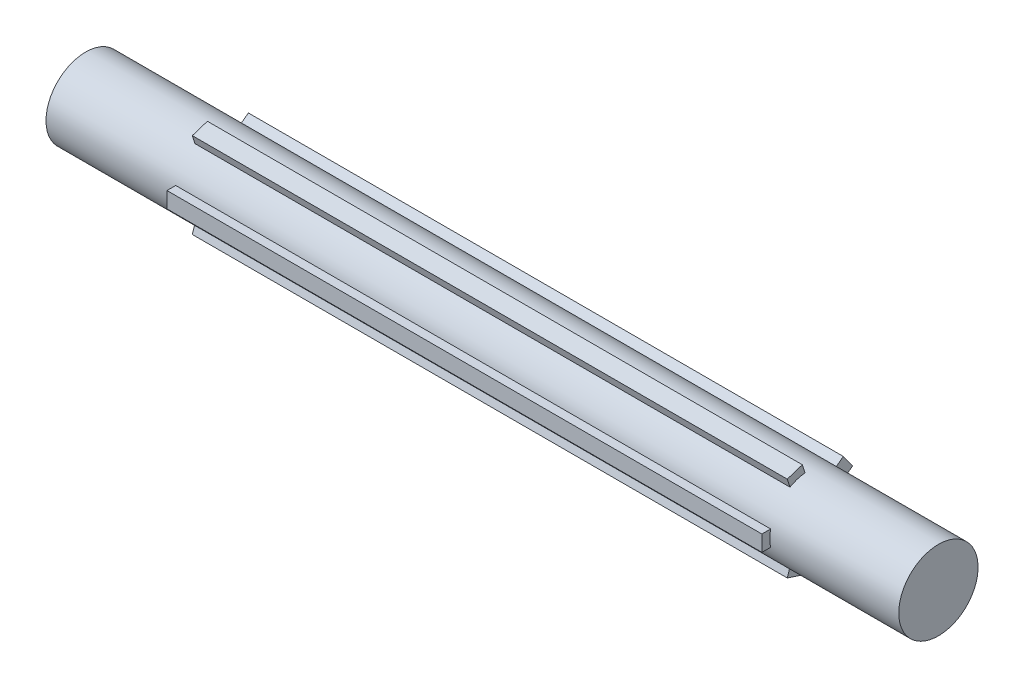
ISO-10303-21;
HEADER;
FILE_DESCRIPTION(('STEP AP214'),'2;1');
FILE_NAME('part.step','',(''),(''),'','','');
FILE_SCHEMA(('AUTOMOTIVE_DESIGN { 1 0 10303 214 1 1 1 1 }'));
ENDSEC;
DATA;
#1=APPLICATION_CONTEXT('core data for automotive mechanical design processes');
#2=APPLICATION_PROTOCOL_DEFINITION('international standard','automotive_design',2000,#1);
#3=PRODUCT_CONTEXT('',#1,'mechanical');
#4=PRODUCT('Part','Part','',(#3));
#5=PRODUCT_RELATED_PRODUCT_CATEGORY('part','',(#4));
#6=PRODUCT_DEFINITION_FORMATION('','',#4);
#7=PRODUCT_DEFINITION_CONTEXT('part definition',#1,'design');
#8=PRODUCT_DEFINITION('design','',#6,#7);
#9=PRODUCT_DEFINITION_SHAPE('','',#8);
#10=(LENGTH_UNIT() NAMED_UNIT(*) SI_UNIT(.MILLI.,.METRE.));
#11=(NAMED_UNIT(*) PLANE_ANGLE_UNIT() SI_UNIT($,.RADIAN.));
#12=(NAMED_UNIT(*) SI_UNIT($,.STERADIAN.) SOLID_ANGLE_UNIT());
#13=UNCERTAINTY_MEASURE_WITH_UNIT(LENGTH_MEASURE(1.E-05),#10,'distance_accuracy_value','');
#14=(GEOMETRIC_REPRESENTATION_CONTEXT(3) GLOBAL_UNCERTAINTY_ASSIGNED_CONTEXT((#13)) GLOBAL_UNIT_ASSIGNED_CONTEXT((#10,
#11,#12)) REPRESENTATION_CONTEXT('',''));
#15=CARTESIAN_POINT('',(0.,0.,0.));
#16=DIRECTION('',(0.,0.,1.));
#17=DIRECTION('',(1.,0.,0.));
#18=AXIS2_PLACEMENT_3D('',#15,#16,#17);
#19=CARTESIAN_POINT('',(0.,0.,0.));
#20=DIRECTION('',(-1.,0.,0.));
#21=DIRECTION('',(0.,0.,1.));
#22=AXIS2_PLACEMENT_3D('',#19,#20,#21);
#23=CYLINDRICAL_SURFACE('',#22,10.);
#24=CARTESIAN_POINT('',(75.,0.,0.));
#25=DIRECTION('',(-1.,0.,0.));
#26=DIRECTION('',(0.,0.,1.));
#27=AXIS2_PLACEMENT_3D('',#24,#25,#26);
#28=CIRCLE('',#27,10.);
#29=CARTESIAN_POINT('',(75.,-4.14106179704873,-9.10228582241975));
#30=VERTEX_POINT('',#29);
#31=CARTESIAN_POINT('',(75.,-7.3771297745485,-6.75114481324983));
#32=VERTEX_POINT('',#31);
#33=EDGE_CURVE('E332',#30,#32,#28,.T.);
#34=ORIENTED_EDGE('',*,*,#33,.F.);
#35=DIRECTION('',(-1.,0.,0.));
#36=VECTOR('',#35,1.);
#37=CARTESIAN_POINT('',(0.,-4.14106179704873,-9.10228582241975));
#38=LINE('',#37,#36);
#39=CARTESIAN_POINT('',(-75.,-4.14106179704873,-9.10228582241975));
#40=VERTEX_POINT('',#39);
#41=EDGE_CURVE('E328',#40,#30,#38,.F.);
#42=ORIENTED_EDGE('',*,*,#41,.F.);
#43=CARTESIAN_POINT('',(-75.,0.,0.));
#44=DIRECTION('',(-1.,0.,0.));
#45=DIRECTION('',(0.,0.,1.));
#46=AXIS2_PLACEMENT_3D('',#43,#44,#45);
#47=CIRCLE('',#46,10.);
#48=CARTESIAN_POINT('',(-75.,-7.3771297745485,-6.75114481324983));
#49=VERTEX_POINT('',#48);
#50=EDGE_CURVE('E325',#40,#49,#47,.T.);
#51=ORIENTED_EDGE('',*,*,#50,.T.);
#52=DIRECTION('',(-1.,0.,0.));
#53=VECTOR('',#52,1.);
#54=CARTESIAN_POINT('',(0.,-7.3771297745485,-6.75114481324983));
#55=LINE('',#54,#53);
#56=EDGE_CURVE('E330',#32,#49,#55,.T.);
#57=ORIENTED_EDGE('',*,*,#56,.F.);
#58=EDGE_LOOP('',(#34,#42,#51,#57));
#59=FACE_BOUND('',#58,.T.);
#60=CARTESIAN_POINT('',(75.,0.,0.));
#61=DIRECTION('',(-1.,0.,0.));
#62=DIRECTION('',(0.,0.,1.));
#63=AXIS2_PLACEMENT_3D('',#60,#61,#62);
#64=CIRCLE('',#63,10.);
#65=CARTESIAN_POINT('',(75.,8.70037873713845,4.92984886485877));
#66=VERTEX_POINT('',#65);
#67=CARTESIAN_POINT('',(75.,9.93644671463823,1.12562279967815));
#68=VERTEX_POINT('',#67);
#69=EDGE_CURVE('E315',#66,#68,#64,.T.);
#70=ORIENTED_EDGE('',*,*,#69,.F.);
#71=DIRECTION('',(-1.,0.,0.));
#72=VECTOR('',#71,1.);
#73=CARTESIAN_POINT('',(0.,8.70037873713844,4.92984886485877));
#74=LINE('',#73,#72);
#75=CARTESIAN_POINT('',(-75.,8.70037873713845,4.92984886485877));
#76=VERTEX_POINT('',#75);
#77=EDGE_CURVE('E310',#76,#66,#74,.F.);
#78=ORIENTED_EDGE('',*,*,#77,.F.);
#79=CARTESIAN_POINT('',(-75.,0.,0.));
#80=DIRECTION('',(-1.,0.,0.));
#81=DIRECTION('',(0.,0.,1.));
#82=AXIS2_PLACEMENT_3D('',#79,#80,#81);
#83=CIRCLE('',#82,10.);
#84=CARTESIAN_POINT('',(-75.,9.93644671463823,1.12562279967815));
#85=VERTEX_POINT('',#84);
#86=EDGE_CURVE('E307',#76,#85,#83,.T.);
#87=ORIENTED_EDGE('',*,*,#86,.T.);
#88=DIRECTION('',(-1.,0.,0.));
#89=VECTOR('',#88,1.);
#90=CARTESIAN_POINT('',(0.,9.93644671463822,1.12562279967815));
#91=LINE('',#90,#89);
#92=EDGE_CURVE('E312',#68,#85,#91,.T.);
#93=ORIENTED_EDGE('',*,*,#92,.F.);
#94=EDGE_LOOP('',(#70,#78,#87,#93));
#95=FACE_BOUND('',#94,.T.);
#96=CARTESIAN_POINT('',(107.5,0.,0.));
#97=DIRECTION('',(-1.,0.,0.));
#98=DIRECTION('',(0.,0.,1.));
#99=AXIS2_PLACEMENT_3D('',#96,#97,#98);
#100=CIRCLE('',#99,10.);
#101=CARTESIAN_POINT('',(107.5,0.,10.));
#102=VERTEX_POINT('',#101);
#103=EDGE_CURVE('E294',#102,#102,#100,.T.);
#104=ORIENTED_EDGE('',*,*,#103,.T.);
#105=EDGE_LOOP('',(#104));
#106=FACE_BOUND('',#105,.T.);
#107=CARTESIAN_POINT('',(-107.5,0.,0.));
#108=DIRECTION('',(-1.,0.,0.));
#109=DIRECTION('',(0.,0.,1.));
#110=AXIS2_PLACEMENT_3D('',#107,#108,#109);
#111=CIRCLE('',#110,10.);
#112=CARTESIAN_POINT('',(-107.5,0.,10.));
#113=VERTEX_POINT('',#112);
#114=EDGE_CURVE('E291',#113,#113,#111,.T.);
#115=ORIENTED_EDGE('',*,*,#114,.F.);
#116=EDGE_LOOP('',(#115));
#117=FACE_BOUND('',#116,.T.);
#118=CARTESIAN_POINT('',(75.,0.,0.));
#119=DIRECTION('',(-1.,0.,0.));
#120=DIRECTION('',(0.,0.,1.));
#121=AXIS2_PLACEMENT_3D('',#118,#119,#120);
#122=CIRCLE('',#121,10.);
#123=CARTESIAN_POINT('',(75.,-2.,9.79795897113271));
#124=VERTEX_POINT('',#123);
#125=CARTESIAN_POINT('',(75.,2.,9.79795897113271));
#126=VERTEX_POINT('',#125);
#127=EDGE_CURVE('E305',#124,#126,#122,.T.);
#128=ORIENTED_EDGE('',*,*,#127,.F.);
#129=DIRECTION('',(-1.,0.,0.));
#130=VECTOR('',#129,1.);
#131=CARTESIAN_POINT('',(0.,-2.,9.79795897113271));
#132=LINE('',#131,#130);
#133=CARTESIAN_POINT('',(-75.,-2.,9.79795897113271));
#134=VERTEX_POINT('',#133);
#135=EDGE_CURVE('E300',#134,#124,#132,.F.);
#136=ORIENTED_EDGE('',*,*,#135,.F.);
#137=CARTESIAN_POINT('',(-75.,0.,0.));
#138=DIRECTION('',(-1.,0.,0.));
#139=DIRECTION('',(0.,0.,1.));
#140=AXIS2_PLACEMENT_3D('',#137,#138,#139);
#141=CIRCLE('',#140,10.);
#142=CARTESIAN_POINT('',(-75.,2.,9.79795897113271));
#143=VERTEX_POINT('',#142);
#144=EDGE_CURVE('E297',#134,#143,#141,.T.);
#145=ORIENTED_EDGE('',*,*,#144,.T.);
#146=DIRECTION('',(-1.,0.,0.));
#147=VECTOR('',#146,1.);
#148=CARTESIAN_POINT('',(0.,2.,9.79795897113271));
#149=LINE('',#148,#147);
#150=EDGE_CURVE('E302',#126,#143,#149,.T.);
#151=ORIENTED_EDGE('',*,*,#150,.F.);
#152=EDGE_LOOP('',(#128,#136,#145,#151));
#153=FACE_BOUND('',#152,.T.);
#154=CARTESIAN_POINT('',(75.,0.,0.));
#155=DIRECTION('',(-1.,0.,0.));
#156=DIRECTION('',(0.,0.,1.));
#157=AXIS2_PLACEMENT_3D('',#154,#155,#156);
#158=CIRCLE('',#157,10.);
#159=CARTESIAN_POINT('',(75.,7.3771297745484,-6.75114481324993));
#160=VERTEX_POINT('',#159);
#161=CARTESIAN_POINT('',(75.,4.1410617970486,-9.10228582241981));
#162=VERTEX_POINT('',#161);
#163=EDGE_CURVE('E186',#160,#162,#158,.T.);
#164=ORIENTED_EDGE('',*,*,#163,.F.);
#165=DIRECTION('',(-1.,0.,0.));
#166=VECTOR('',#165,1.);
#167=CARTESIAN_POINT('',(0.,7.3771297745484,-6.75114481324993));
#168=LINE('',#167,#166);
#169=CARTESIAN_POINT('',(-75.,7.3771297745484,-6.75114481324993));
#170=VERTEX_POINT('',#169);
#171=EDGE_CURVE('E320',#170,#160,#168,.F.);
#172=ORIENTED_EDGE('',*,*,#171,.F.);
#173=CARTESIAN_POINT('',(-75.,0.,0.));
#174=DIRECTION('',(-1.,0.,0.));
#175=DIRECTION('',(0.,0.,1.));
#176=AXIS2_PLACEMENT_3D('',#173,#174,#175);
#177=CIRCLE('',#176,10.);
#178=CARTESIAN_POINT('',(-75.,4.1410617970486,-9.10228582241981));
#179=VERTEX_POINT('',#178);
#180=EDGE_CURVE('E317',#170,#179,#177,.T.);
#181=ORIENTED_EDGE('',*,*,#180,.T.);
#182=DIRECTION('',(-1.,0.,0.));
#183=VECTOR('',#182,1.);
#184=CARTESIAN_POINT('',(0.,4.1410617970486,-9.10228582241981));
#185=LINE('',#184,#183);
#186=EDGE_CURVE('E322',#162,#179,#185,.T.);
#187=ORIENTED_EDGE('',*,*,#186,.F.);
#188=EDGE_LOOP('',(#164,#172,#181,#187));
#189=FACE_BOUND('',#188,.T.);
#190=CARTESIAN_POINT('',(75.,0.,0.));
#191=DIRECTION('',(-1.,0.,0.));
#192=DIRECTION('',(0.,0.,1.));
#193=AXIS2_PLACEMENT_3D('',#190,#191,#192);
#194=CIRCLE('',#193,10.);
#195=CARTESIAN_POINT('',(75.,-9.93644671463821,1.12562279967829));
#196=VERTEX_POINT('',#195);
#197=CARTESIAN_POINT('',(75.,-8.70037873713838,4.92984886485889));
#198=VERTEX_POINT('',#197);
#199=EDGE_CURVE('E11',#196,#198,#194,.T.);
#200=ORIENTED_EDGE('',*,*,#199,.F.);
#201=DIRECTION('',(-1.,0.,0.));
#202=VECTOR('',#201,1.);
#203=CARTESIAN_POINT('',(0.,-9.93644671463821,1.12562279967829));
#204=LINE('',#203,#202);
#205=CARTESIAN_POINT('',(-75.,-9.93644671463821,1.12562279967829));
#206=VERTEX_POINT('',#205);
#207=EDGE_CURVE('E337',#206,#196,#204,.F.);
#208=ORIENTED_EDGE('',*,*,#207,.F.);
#209=CARTESIAN_POINT('',(-75.,0.,0.));
#210=DIRECTION('',(-1.,0.,0.));
#211=DIRECTION('',(0.,0.,1.));
#212=AXIS2_PLACEMENT_3D('',#209,#210,#211);
#213=CIRCLE('',#212,10.);
#214=CARTESIAN_POINT('',(-75.,-8.70037873713838,4.92984886485889));
#215=VERTEX_POINT('',#214);
#216=EDGE_CURVE('E334',#206,#215,#213,.T.);
#217=ORIENTED_EDGE('',*,*,#216,.T.);
#218=DIRECTION('',(-1.,0.,0.));
#219=VECTOR('',#218,1.);
#220=CARTESIAN_POINT('',(0.,-8.70037873713837,4.92984886485889));
#221=LINE('',#220,#219);
#222=EDGE_CURVE('E51',#198,#215,#221,.T.);
#223=ORIENTED_EDGE('',*,*,#222,.F.);
#224=EDGE_LOOP('',(#200,#208,#217,#223));
#225=FACE_BOUND('',#224,.T.);
#226=ADVANCED_FACE('F43',(#59,#95,#106,#117,#153,#189,#225),#23,.T.);
#227=CARTESIAN_POINT('',(-107.5,10.,0.));
#228=DIRECTION('',(1.,0.,0.));
#229=DIRECTION('',(0.,0.,-1.));
#230=AXIS2_PLACEMENT_3D('',#227,#228,#229);
#231=PLANE('',#230);
#232=ORIENTED_EDGE('',*,*,#114,.T.);
#233=EDGE_LOOP('',(#232));
#234=FACE_BOUND('',#233,.T.);
#235=ADVANCED_FACE('F45',(#234),#231,.F.);
#236=CARTESIAN_POINT('',(107.5,10.,0.));
#237=DIRECTION('',(-1.,0.,0.));
#238=DIRECTION('',(0.,0.,1.));
#239=AXIS2_PLACEMENT_3D('',#236,#237,#238);
#240=PLANE('',#239);
#241=ORIENTED_EDGE('',*,*,#103,.F.);
#242=EDGE_LOOP('',(#241));
#243=FACE_BOUND('',#242,.T.);
#244=ADVANCED_FACE('F374',(#243),#240,.F.);
#245=CARTESIAN_POINT('',(75.,2.,12.));
#246=DIRECTION('',(0.,-1.,0.));
#247=DIRECTION('',(0.,0.,-1.));
#248=AXIS2_PLACEMENT_3D('',#245,#246,#247);
#249=PLANE('',#248);
#250=DIRECTION('',(0.,0.,1.));
#251=VECTOR('',#250,1.);
#252=CARTESIAN_POINT('',(75.,2.,12.));
#253=LINE('',#252,#251);
#254=CARTESIAN_POINT('',(75.,2.,12.));
#255=VERTEX_POINT('',#254);
#256=EDGE_CURVE('E272',#126,#255,#253,.T.);
#257=ORIENTED_EDGE('',*,*,#256,.F.);
#258=ORIENTED_EDGE('',*,*,#150,.T.);
#259=DIRECTION('',(0.,0.,1.));
#260=VECTOR('',#259,1.);
#261=CARTESIAN_POINT('',(-75.,2.,12.));
#262=LINE('',#261,#260);
#263=CARTESIAN_POINT('',(-75.,2.,12.));
#264=VERTEX_POINT('',#263);
#265=EDGE_CURVE('E271',#143,#264,#262,.T.);
#266=ORIENTED_EDGE('',*,*,#265,.T.);
#267=DIRECTION('',(-1.,0.,0.));
#268=VECTOR('',#267,1.);
#269=CARTESIAN_POINT('',(75.,2.,12.));
#270=LINE('',#269,#268);
#271=EDGE_CURVE('E288',#255,#264,#270,.T.);
#272=ORIENTED_EDGE('',*,*,#271,.F.);
#273=EDGE_LOOP('',(#257,#258,#266,#272));
#274=FACE_BOUND('',#273,.T.);
#275=ADVANCED_FACE('F379',(#274),#249,.F.);
#276=CARTESIAN_POINT('',(75.,-2.,12.));
#277=DIRECTION('',(0.,1.,0.));
#278=DIRECTION('',(0.,0.,1.));
#279=AXIS2_PLACEMENT_3D('',#276,#277,#278);
#280=PLANE('',#279);
#281=DIRECTION('',(0.,0.,-1.));
#282=VECTOR('',#281,1.);
#283=CARTESIAN_POINT('',(-75.,-2.,12.));
#284=LINE('',#283,#282);
#285=CARTESIAN_POINT('',(-75.,-2.,12.));
#286=VERTEX_POINT('',#285);
#287=EDGE_CURVE('E275',#286,#134,#284,.T.);
#288=ORIENTED_EDGE('',*,*,#287,.T.);
#289=ORIENTED_EDGE('',*,*,#135,.T.);
#290=DIRECTION('',(0.,0.,-1.));
#291=VECTOR('',#290,1.);
#292=CARTESIAN_POINT('',(75.,-2.,12.));
#293=LINE('',#292,#291);
#294=CARTESIAN_POINT('',(75.,-2.,12.));
#295=VERTEX_POINT('',#294);
#296=EDGE_CURVE('E277',#295,#124,#293,.T.);
#297=ORIENTED_EDGE('',*,*,#296,.F.);
#298=DIRECTION('',(-1.,0.,0.));
#299=VECTOR('',#298,1.);
#300=CARTESIAN_POINT('',(75.,-2.,12.));
#301=LINE('',#300,#299);
#302=EDGE_CURVE('E280',#295,#286,#301,.T.);
#303=ORIENTED_EDGE('',*,*,#302,.T.);
#304=EDGE_LOOP('',(#288,#289,#297,#303));
#305=FACE_BOUND('',#304,.T.);
#306=ADVANCED_FACE('F386',(#305),#280,.F.);
#307=CARTESIAN_POINT('',(75.,-2.,12.));
#308=DIRECTION('',(0.,0.,-1.));
#309=DIRECTION('',(-1.,0.,0.));
#310=AXIS2_PLACEMENT_3D('',#307,#308,#309);
#311=PLANE('',#310);
#312=DIRECTION('',(0.,-1.,0.));
#313=VECTOR('',#312,1.);
#314=CARTESIAN_POINT('',(-75.,-2.,12.));
#315=LINE('',#314,#313);
#316=EDGE_CURVE('E282',#264,#286,#315,.T.);
#317=ORIENTED_EDGE('',*,*,#316,.T.);
#318=ORIENTED_EDGE('',*,*,#302,.F.);
#319=DIRECTION('',(0.,-1.,0.));
#320=VECTOR('',#319,1.);
#321=CARTESIAN_POINT('',(75.,-2.,12.));
#322=LINE('',#321,#320);
#323=EDGE_CURVE('E274',#255,#295,#322,.T.);
#324=ORIENTED_EDGE('',*,*,#323,.F.);
#325=ORIENTED_EDGE('',*,*,#271,.T.);
#326=EDGE_LOOP('',(#317,#318,#324,#325));
#327=FACE_BOUND('',#326,.T.);
#328=ADVANCED_FACE('F535',(#327),#311,.F.);
#329=CARTESIAN_POINT('',(75.,0.,0.));
#330=DIRECTION('',(-1.,0.,0.));
#331=DIRECTION('',(0.,0.,1.));
#332=AXIS2_PLACEMENT_3D('',#329,#330,#331);
#333=PLANE('',#332);
#334=ORIENTED_EDGE('',*,*,#296,.T.);
#335=ORIENTED_EDGE('',*,*,#127,.T.);
#336=ORIENTED_EDGE('',*,*,#256,.T.);
#337=ORIENTED_EDGE('',*,*,#323,.T.);
#338=EDGE_LOOP('',(#334,#335,#336,#337));
#339=FACE_BOUND('',#338,.T.);
#340=ADVANCED_FACE('F525',(#339),#333,.F.);
#341=CARTESIAN_POINT('',(-75.,0.,0.));
#342=DIRECTION('',(-1.,0.,0.));
#343=DIRECTION('',(0.,0.,1.));
#344=AXIS2_PLACEMENT_3D('',#341,#342,#343);
#345=PLANE('',#344);
#346=ORIENTED_EDGE('',*,*,#144,.F.);
#347=ORIENTED_EDGE('',*,*,#287,.F.);
#348=ORIENTED_EDGE('',*,*,#316,.F.);
#349=ORIENTED_EDGE('',*,*,#265,.F.);
#350=EDGE_LOOP('',(#346,#347,#348,#349));
#351=FACE_BOUND('',#350,.T.);
#352=ADVANCED_FACE('F512',(#351),#345,.T.);
#353=CARTESIAN_POINT('',(75.,12.0307121842917,1.80609089990903));
#354=DIRECTION('',(0.,-0.309016994374945,0.951056516295154));
#355=DIRECTION('',(0.,-0.951056516295155,-0.309016994374945));
#356=AXIS2_PLACEMENT_3D('',#353,#354,#355);
#357=PLANE('',#356);
#358=DIRECTION('',(0.,0.951056516295155,0.309016994374945));
#359=VECTOR('',#358,1.);
#360=CARTESIAN_POINT('',(75.,12.0307121842917,1.80609089990903));
#361=LINE('',#360,#359);
#362=CARTESIAN_POINT('',(75.,12.0307121842917,1.80609089990903));
#363=VERTEX_POINT('',#362);
#364=EDGE_CURVE('E252',#68,#363,#361,.T.);
#365=ORIENTED_EDGE('',*,*,#364,.F.);
#366=ORIENTED_EDGE('',*,*,#92,.T.);
#367=DIRECTION('',(0.,0.951056516295155,0.309016994374945));
#368=VECTOR('',#367,1.);
#369=CARTESIAN_POINT('',(-75.,12.0307121842917,1.80609089990903));
#370=LINE('',#369,#368);
#371=CARTESIAN_POINT('',(-75.,12.0307121842917,1.80609089990903));
#372=VERTEX_POINT('',#371);
#373=EDGE_CURVE('E198',#85,#372,#370,.T.);
#374=ORIENTED_EDGE('',*,*,#373,.T.);
#375=DIRECTION('',(-1.,0.,0.));
#376=VECTOR('',#375,1.);
#377=CARTESIAN_POINT('',(75.,12.0307121842917,1.80609089990903));
#378=LINE('',#377,#376);
#379=EDGE_CURVE('E268',#363,#372,#378,.T.);
#380=ORIENTED_EDGE('',*,*,#379,.F.);
#381=EDGE_LOOP('',(#365,#366,#374,#380));
#382=FACE_BOUND('',#381,.T.);
#383=ADVANCED_FACE('F503',(#382),#357,.F.);
#384=CARTESIAN_POINT('',(75.,10.794644206792,5.61031696508965));
#385=DIRECTION('',(0.,0.309016994374945,-0.951056516295154));
#386=DIRECTION('',(0.,0.951056516295155,0.309016994374945));
#387=AXIS2_PLACEMENT_3D('',#384,#385,#386);
#388=PLANE('',#387);
#389=DIRECTION('',(0.,-0.951056516295155,-0.309016994374945));
#390=VECTOR('',#389,1.);
#391=CARTESIAN_POINT('',(-75.,10.794644206792,5.61031696508965));
#392=LINE('',#391,#390);
#393=CARTESIAN_POINT('',(-75.,10.794644206792,5.61031696508965));
#394=VERTEX_POINT('',#393);
#395=EDGE_CURVE('E255',#394,#76,#392,.T.);
#396=ORIENTED_EDGE('',*,*,#395,.T.);
#397=ORIENTED_EDGE('',*,*,#77,.T.);
#398=DIRECTION('',(0.,-0.951056516295155,-0.309016994374945));
#399=VECTOR('',#398,1.);
#400=CARTESIAN_POINT('',(75.,10.794644206792,5.61031696508965));
#401=LINE('',#400,#399);
#402=CARTESIAN_POINT('',(75.,10.794644206792,5.61031696508965));
#403=VERTEX_POINT('',#402);
#404=EDGE_CURVE('E257',#403,#66,#401,.T.);
#405=ORIENTED_EDGE('',*,*,#404,.F.);
#406=DIRECTION('',(-1.,0.,0.));
#407=VECTOR('',#406,1.);
#408=CARTESIAN_POINT('',(75.,10.794644206792,5.61031696508965));
#409=LINE('',#408,#407);
#410=EDGE_CURVE('E260',#403,#394,#409,.T.);
#411=ORIENTED_EDGE('',*,*,#410,.T.);
#412=EDGE_LOOP('',(#396,#397,#405,#411));
#413=FACE_BOUND('',#412,.T.);
#414=ADVANCED_FACE('F493',(#413),#388,.F.);
#415=CARTESIAN_POINT('',(75.,10.794644206792,5.61031696508965));
#416=DIRECTION('',(0.,-0.951056516295154,-0.309016994374945));
#417=DIRECTION('',(0.,0.309016994374945,-0.951056516295155));
#418=AXIS2_PLACEMENT_3D('',#415,#416,#417);
#419=PLANE('',#418);
#420=DIRECTION('',(0.,-0.309016994374945,0.951056516295155));
#421=VECTOR('',#420,1.);
#422=CARTESIAN_POINT('',(-75.,10.794644206792,5.61031696508965));
#423=LINE('',#422,#421);
#424=EDGE_CURVE('E262',#372,#394,#423,.T.);
#425=ORIENTED_EDGE('',*,*,#424,.T.);
#426=ORIENTED_EDGE('',*,*,#410,.F.);
#427=DIRECTION('',(0.,-0.309016994374945,0.951056516295155));
#428=VECTOR('',#427,1.);
#429=CARTESIAN_POINT('',(75.,10.794644206792,5.61031696508965));
#430=LINE('',#429,#428);
#431=EDGE_CURVE('E254',#363,#403,#430,.T.);
#432=ORIENTED_EDGE('',*,*,#431,.F.);
#433=ORIENTED_EDGE('',*,*,#379,.T.);
#434=EDGE_LOOP('',(#425,#426,#432,#433));
#435=FACE_BOUND('',#434,.T.);
#436=ADVANCED_FACE('F483',(#435),#419,.F.);
#437=CARTESIAN_POINT('',(75.,0.,0.));
#438=DIRECTION('',(-1.,0.,0.));
#439=DIRECTION('',(0.,0.951056516295155,0.309016994374945));
#440=AXIS2_PLACEMENT_3D('',#437,#438,#439);
#441=PLANE('',#440);
#442=ORIENTED_EDGE('',*,*,#404,.T.);
#443=ORIENTED_EDGE('',*,*,#69,.T.);
#444=ORIENTED_EDGE('',*,*,#364,.T.);
#445=ORIENTED_EDGE('',*,*,#431,.T.);
#446=EDGE_LOOP('',(#442,#443,#444,#445));
#447=FACE_BOUND('',#446,.T.);
#448=ADVANCED_FACE('F473',(#447),#441,.F.);
#449=CARTESIAN_POINT('',(-75.,0.,0.));
#450=DIRECTION('',(-1.,0.,0.));
#451=DIRECTION('',(0.,0.951056516295155,0.309016994374945));
#452=AXIS2_PLACEMENT_3D('',#449,#450,#451);
#453=PLANE('',#452);
#454=ORIENTED_EDGE('',*,*,#86,.F.);
#455=ORIENTED_EDGE('',*,*,#395,.F.);
#456=ORIENTED_EDGE('',*,*,#424,.F.);
#457=ORIENTED_EDGE('',*,*,#373,.F.);
#458=EDGE_LOOP('',(#454,#455,#456,#457));
#459=FACE_BOUND('',#458,.T.);
#460=ADVANCED_FACE('F410',(#459),#453,.T.);
#461=CARTESIAN_POINT('',(75.,5.43538903875972,-10.8837744370843));
#462=DIRECTION('',(0.,0.809016994374951,0.587785252292469));
#463=DIRECTION('',(0.,-0.587785252292469,0.809016994374951));
#464=AXIS2_PLACEMENT_3D('',#461,#462,#463);
#465=PLANE('',#464);
#466=DIRECTION('',(0.,0.587785252292469,-0.809016994374951));
#467=VECTOR('',#466,1.);
#468=CARTESIAN_POINT('',(75.,5.43538903875972,-10.8837744370843));
#469=LINE('',#468,#467);
#470=CARTESIAN_POINT('',(75.,5.43538903875972,-10.8837744370843));
#471=VERTEX_POINT('',#470);
#472=EDGE_CURVE('E178',#162,#471,#469,.T.);
#473=ORIENTED_EDGE('',*,*,#472,.F.);
#474=ORIENTED_EDGE('',*,*,#186,.T.);
#475=DIRECTION('',(0.,0.587785252292469,-0.809016994374951));
#476=VECTOR('',#475,1.);
#477=CARTESIAN_POINT('',(-75.,5.43538903875972,-10.8837744370843));
#478=LINE('',#477,#476);
#479=CARTESIAN_POINT('',(-75.,5.43538903875972,-10.8837744370843));
#480=VERTEX_POINT('',#479);
#481=EDGE_CURVE('E195',#179,#480,#478,.T.);
#482=ORIENTED_EDGE('',*,*,#481,.T.);
#483=DIRECTION('',(-1.,0.,0.));
#484=VECTOR('',#483,1.);
#485=CARTESIAN_POINT('',(75.,5.43538903875972,-10.8837744370843));
#486=LINE('',#485,#484);
#487=EDGE_CURVE('E193',#471,#480,#486,.T.);
#488=ORIENTED_EDGE('',*,*,#487,.F.);
#489=EDGE_LOOP('',(#473,#474,#482,#488));
#490=FACE_BOUND('',#489,.T.);
#491=ADVANCED_FACE('F194',(#490),#465,.F.);
#492=CARTESIAN_POINT('',(75.,8.67145701625953,-8.53263342791447));
#493=DIRECTION('',(0.,-0.809016994374951,-0.587785252292469));
#494=DIRECTION('',(0.,0.587785252292469,-0.809016994374951));
#495=AXIS2_PLACEMENT_3D('',#492,#493,#494);
#496=PLANE('',#495);
#497=DIRECTION('',(0.,-0.587785252292469,0.809016994374951));
#498=VECTOR('',#497,1.);
#499=CARTESIAN_POINT('',(-75.,8.67145701625953,-8.53263342791447));
#500=LINE('',#499,#498);
#501=CARTESIAN_POINT('',(-75.,8.67145701625953,-8.53263342791447));
#502=VERTEX_POINT('',#501);
#503=EDGE_CURVE('E190',#502,#170,#500,.T.);
#504=ORIENTED_EDGE('',*,*,#503,.T.);
#505=ORIENTED_EDGE('',*,*,#171,.T.);
#506=DIRECTION('',(0.,-0.587785252292469,0.809016994374951));
#507=VECTOR('',#506,1.);
#508=CARTESIAN_POINT('',(75.,8.67145701625953,-8.53263342791447));
#509=LINE('',#508,#507);
#510=CARTESIAN_POINT('',(75.,8.67145701625953,-8.53263342791447));
#511=VERTEX_POINT('',#510);
#512=EDGE_CURVE('E204',#511,#160,#509,.T.);
#513=ORIENTED_EDGE('',*,*,#512,.F.);
#514=DIRECTION('',(-1.,0.,0.));
#515=VECTOR('',#514,1.);
#516=CARTESIAN_POINT('',(75.,8.67145701625953,-8.53263342791447));
#517=LINE('',#516,#515);
#518=EDGE_CURVE('E199',#511,#502,#517,.T.);
#519=ORIENTED_EDGE('',*,*,#518,.T.);
#520=EDGE_LOOP('',(#504,#505,#513,#519));
#521=FACE_BOUND('',#520,.T.);
#522=ADVANCED_FACE('F402',(#521),#496,.F.);
#523=CARTESIAN_POINT('',(75.,8.67145701625953,-8.53263342791447));
#524=DIRECTION('',(0.,-0.587785252292469,0.809016994374951));
#525=DIRECTION('',(0.,-0.809016994374951,-0.587785252292469));
#526=AXIS2_PLACEMENT_3D('',#523,#524,#525);
#527=PLANE('',#526);
#528=DIRECTION('',(0.,0.809016994374951,0.587785252292469));
#529=VECTOR('',#528,1.);
#530=CARTESIAN_POINT('',(-75.,8.67145701625953,-8.53263342791447));
#531=LINE('',#530,#529);
#532=EDGE_CURVE('E209',#480,#502,#531,.T.);
#533=ORIENTED_EDGE('',*,*,#532,.T.);
#534=ORIENTED_EDGE('',*,*,#518,.F.);
#535=DIRECTION('',(0.,0.809016994374951,0.587785252292469));
#536=VECTOR('',#535,1.);
#537=CARTESIAN_POINT('',(75.,8.67145701625953,-8.53263342791447));
#538=LINE('',#537,#536);
#539=EDGE_CURVE('E183',#471,#511,#538,.T.);
#540=ORIENTED_EDGE('',*,*,#539,.F.);
#541=ORIENTED_EDGE('',*,*,#487,.T.);
#542=EDGE_LOOP('',(#533,#534,#540,#541));
#543=FACE_BOUND('',#542,.T.);
#544=ADVANCED_FACE('F201',(#543),#527,.F.);
#545=CARTESIAN_POINT('',(75.,0.,0.));
#546=DIRECTION('',(-1.,0.,0.));
#547=DIRECTION('',(0.,0.587785252292469,-0.809016994374951));
#548=AXIS2_PLACEMENT_3D('',#545,#546,#547);
#549=PLANE('',#548);
#550=ORIENTED_EDGE('',*,*,#512,.T.);
#551=ORIENTED_EDGE('',*,*,#163,.T.);
#552=ORIENTED_EDGE('',*,*,#472,.T.);
#553=ORIENTED_EDGE('',*,*,#539,.T.);
#554=EDGE_LOOP('',(#550,#551,#552,#553));
#555=FACE_BOUND('',#554,.T.);
#556=ADVANCED_FACE('F181',(#555),#549,.F.);
#557=CARTESIAN_POINT('',(-75.,0.,0.));
#558=DIRECTION('',(-1.,0.,0.));
#559=DIRECTION('',(0.,0.587785252292469,-0.809016994374951));
#560=AXIS2_PLACEMENT_3D('',#557,#558,#559);
#561=PLANE('',#560);
#562=ORIENTED_EDGE('',*,*,#180,.F.);
#563=ORIENTED_EDGE('',*,*,#503,.F.);
#564=ORIENTED_EDGE('',*,*,#532,.F.);
#565=ORIENTED_EDGE('',*,*,#481,.F.);
#566=EDGE_LOOP('',(#562,#563,#564,#565));
#567=FACE_BOUND('',#566,.T.);
#568=ADVANCED_FACE('F400',(#567),#561,.T.);
#569=CARTESIAN_POINT('',(75.,-8.67145701625965,-8.53263342791435));
#570=DIRECTION('',(0.,0.809016994374942,-0.58778525229248));
#571=DIRECTION('',(0.,0.58778525229248,0.809016994374942));
#572=AXIS2_PLACEMENT_3D('',#569,#570,#571);
#573=PLANE('',#572);
#574=DIRECTION('',(0.,-0.58778525229248,-0.809016994374942));
#575=VECTOR('',#574,1.);
#576=CARTESIAN_POINT('',(75.,-8.67145701625965,-8.53263342791435));
#577=LINE('',#576,#575);
#578=CARTESIAN_POINT('',(75.,-8.67145701625965,-8.53263342791435));
#579=VERTEX_POINT('',#578);
#580=EDGE_CURVE('E215',#32,#579,#577,.T.);
#581=ORIENTED_EDGE('',*,*,#580,.F.);
#582=ORIENTED_EDGE('',*,*,#56,.T.);
#583=DIRECTION('',(0.,-0.58778525229248,-0.809016994374942));
#584=VECTOR('',#583,1.);
#585=CARTESIAN_POINT('',(-75.,-8.67145701625965,-8.53263342791435));
#586=LINE('',#585,#584);
#587=CARTESIAN_POINT('',(-75.,-8.67145701625965,-8.53263342791435));
#588=VERTEX_POINT('',#587);
#589=EDGE_CURVE('E66',#49,#588,#586,.T.);
#590=ORIENTED_EDGE('',*,*,#589,.T.);
#591=DIRECTION('',(-1.,0.,0.));
#592=VECTOR('',#591,1.);
#593=CARTESIAN_POINT('',(75.,-8.67145701625965,-8.53263342791435));
#594=LINE('',#593,#592);
#595=EDGE_CURVE('E210',#579,#588,#594,.T.);
#596=ORIENTED_EDGE('',*,*,#595,.F.);
#597=EDGE_LOOP('',(#581,#582,#590,#596));
#598=FACE_BOUND('',#597,.T.);
#599=ADVANCED_FACE('F426',(#598),#573,.F.);
#600=CARTESIAN_POINT('',(75.,-5.43538903875988,-10.8837744370843));
#601=DIRECTION('',(0.,-0.809016994374942,0.58778525229248));
#602=DIRECTION('',(0.,-0.58778525229248,-0.809016994374942));
#603=AXIS2_PLACEMENT_3D('',#600,#601,#602);
#604=PLANE('',#603);
#605=DIRECTION('',(0.,0.58778525229248,0.809016994374942));
#606=VECTOR('',#605,1.);
#607=CARTESIAN_POINT('',(-75.,-5.43538903875988,-10.8837744370843));
#608=LINE('',#607,#606);
#609=CARTESIAN_POINT('',(-75.,-5.43538903875988,-10.8837744370843));
#610=VERTEX_POINT('',#609);
#611=EDGE_CURVE('E218',#610,#40,#608,.T.);
#612=ORIENTED_EDGE('',*,*,#611,.T.);
#613=ORIENTED_EDGE('',*,*,#41,.T.);
#614=DIRECTION('',(0.,0.58778525229248,0.809016994374942));
#615=VECTOR('',#614,1.);
#616=CARTESIAN_POINT('',(75.,-5.43538903875988,-10.8837744370843));
#617=LINE('',#616,#615);
#618=CARTESIAN_POINT('',(75.,-5.43538903875988,-10.8837744370843));
#619=VERTEX_POINT('',#618);
#620=EDGE_CURVE('E220',#619,#30,#617,.T.);
#621=ORIENTED_EDGE('',*,*,#620,.F.);
#622=DIRECTION('',(-1.,0.,0.));
#623=VECTOR('',#622,1.);
#624=CARTESIAN_POINT('',(75.,-5.43538903875988,-10.8837744370843));
#625=LINE('',#624,#623);
#626=EDGE_CURVE('E223',#619,#610,#625,.T.);
#627=ORIENTED_EDGE('',*,*,#626,.T.);
#628=EDGE_LOOP('',(#612,#613,#621,#627));
#629=FACE_BOUND('',#628,.T.);
#630=ADVANCED_FACE('F423',(#629),#604,.F.);
#631=CARTESIAN_POINT('',(75.,-5.43538903875988,-10.8837744370843));
#632=DIRECTION('',(0.,0.58778525229248,0.809016994374942));
#633=DIRECTION('',(0.,-0.809016994374942,0.58778525229248));
#634=AXIS2_PLACEMENT_3D('',#631,#632,#633);
#635=PLANE('',#634);
#636=DIRECTION('',(0.,0.809016994374942,-0.58778525229248));
#637=VECTOR('',#636,1.);
#638=CARTESIAN_POINT('',(-75.,-5.43538903875988,-10.8837744370843));
#639=LINE('',#638,#637);
#640=EDGE_CURVE('E225',#588,#610,#639,.T.);
#641=ORIENTED_EDGE('',*,*,#640,.T.);
#642=ORIENTED_EDGE('',*,*,#626,.F.);
#643=DIRECTION('',(0.,0.809016994374942,-0.58778525229248));
#644=VECTOR('',#643,1.);
#645=CARTESIAN_POINT('',(75.,-5.43538903875988,-10.8837744370843));
#646=LINE('',#645,#644);
#647=EDGE_CURVE('E217',#579,#619,#646,.T.);
#648=ORIENTED_EDGE('',*,*,#647,.F.);
#649=ORIENTED_EDGE('',*,*,#595,.T.);
#650=EDGE_LOOP('',(#641,#642,#648,#649));
#651=FACE_BOUND('',#650,.T.);
#652=ADVANCED_FACE('F419',(#651),#635,.F.);
#653=CARTESIAN_POINT('',(75.,0.,0.));
#654=DIRECTION('',(-1.,0.,0.));
#655=DIRECTION('',(0.,-0.58778525229248,-0.809016994374942));
#656=AXIS2_PLACEMENT_3D('',#653,#654,#655);
#657=PLANE('',#656);
#658=ORIENTED_EDGE('',*,*,#620,.T.);
#659=ORIENTED_EDGE('',*,*,#33,.T.);
#660=ORIENTED_EDGE('',*,*,#580,.T.);
#661=ORIENTED_EDGE('',*,*,#647,.T.);
#662=EDGE_LOOP('',(#658,#659,#660,#661));
#663=FACE_BOUND('',#662,.T.);
#664=ADVANCED_FACE('F415',(#663),#657,.F.);
#665=CARTESIAN_POINT('',(-75.,0.,0.));
#666=DIRECTION('',(-1.,0.,0.));
#667=DIRECTION('',(0.,-0.58778525229248,-0.809016994374942));
#668=AXIS2_PLACEMENT_3D('',#665,#666,#667);
#669=PLANE('',#668);
#670=ORIENTED_EDGE('',*,*,#50,.F.);
#671=ORIENTED_EDGE('',*,*,#611,.F.);
#672=ORIENTED_EDGE('',*,*,#640,.F.);
#673=ORIENTED_EDGE('',*,*,#589,.F.);
#674=EDGE_LOOP('',(#670,#671,#672,#673));
#675=FACE_BOUND('',#674,.T.);
#676=ADVANCED_FACE('F418',(#675),#669,.T.);
#677=CARTESIAN_POINT('',(75.,-10.7946442067919,5.6103169650898));
#678=DIRECTION('',(0.,-0.309016994374958,-0.95105651629515));
#679=DIRECTION('',(0.,0.95105651629515,-0.309016994374958));
#680=AXIS2_PLACEMENT_3D('',#677,#678,#679);
#681=PLANE('',#680);
#682=DIRECTION('',(0.,-0.95105651629515,0.309016994374958));
#683=VECTOR('',#682,1.);
#684=CARTESIAN_POINT('',(75.,-10.7946442067919,5.6103169650898));
#685=LINE('',#684,#683);
#686=CARTESIAN_POINT('',(75.,-10.7946442067919,5.6103169650898));
#687=VERTEX_POINT('',#686);
#688=EDGE_CURVE('E234',#198,#687,#685,.T.);
#689=ORIENTED_EDGE('',*,*,#688,.F.);
#690=ORIENTED_EDGE('',*,*,#222,.T.);
#691=DIRECTION('',(0.,-0.95105651629515,0.309016994374958));
#692=VECTOR('',#691,1.);
#693=CARTESIAN_POINT('',(-75.,-10.7946442067919,5.6103169650898));
#694=LINE('',#693,#692);
#695=CARTESIAN_POINT('',(-75.,-10.7946442067919,5.6103169650898));
#696=VERTEX_POINT('',#695);
#697=EDGE_CURVE('E58',#215,#696,#694,.T.);
#698=ORIENTED_EDGE('',*,*,#697,.T.);
#699=DIRECTION('',(-1.,0.,0.));
#700=VECTOR('',#699,1.);
#701=CARTESIAN_POINT('',(75.,-10.7946442067919,5.6103169650898));
#702=LINE('',#701,#700);
#703=EDGE_CURVE('E226',#687,#696,#702,.T.);
#704=ORIENTED_EDGE('',*,*,#703,.F.);
#705=EDGE_LOOP('',(#689,#690,#698,#704));
#706=FACE_BOUND('',#705,.T.);
#707=ADVANCED_FACE('F341',(#706),#681,.F.);
#708=CARTESIAN_POINT('',(75.,-12.0307121842917,1.8060908999092));
#709=DIRECTION('',(0.,0.309016994374958,0.95105651629515));
#710=DIRECTION('',(0.,-0.95105651629515,0.309016994374958));
#711=AXIS2_PLACEMENT_3D('',#708,#709,#710);
#712=PLANE('',#711);
#713=DIRECTION('',(0.,0.95105651629515,-0.309016994374958));
#714=VECTOR('',#713,1.);
#715=CARTESIAN_POINT('',(-75.,-12.0307121842917,1.8060908999092));
#716=LINE('',#715,#714);
#717=CARTESIAN_POINT('',(-75.,-12.0307121842917,1.8060908999092));
#718=VERTEX_POINT('',#717);
#719=EDGE_CURVE('E237',#718,#206,#716,.T.);
#720=ORIENTED_EDGE('',*,*,#719,.T.);
#721=ORIENTED_EDGE('',*,*,#207,.T.);
#722=DIRECTION('',(0.,0.95105651629515,-0.309016994374958));
#723=VECTOR('',#722,1.);
#724=CARTESIAN_POINT('',(75.,-12.0307121842917,1.8060908999092));
#725=LINE('',#724,#723);
#726=CARTESIAN_POINT('',(75.,-12.0307121842917,1.8060908999092));
#727=VERTEX_POINT('',#726);
#728=EDGE_CURVE('E239',#727,#196,#725,.T.);
#729=ORIENTED_EDGE('',*,*,#728,.F.);
#730=DIRECTION('',(-1.,0.,0.));
#731=VECTOR('',#730,1.);
#732=CARTESIAN_POINT('',(75.,-12.0307121842917,1.8060908999092));
#733=LINE('',#732,#731);
#734=EDGE_CURVE('E242',#727,#718,#733,.T.);
#735=ORIENTED_EDGE('',*,*,#734,.T.);
#736=EDGE_LOOP('',(#720,#721,#729,#735));
#737=FACE_BOUND('',#736,.T.);
#738=ADVANCED_FACE('F349',(#737),#712,.F.);
#739=CARTESIAN_POINT('',(75.,-12.0307121842917,1.8060908999092));
#740=DIRECTION('',(0.,0.95105651629515,-0.309016994374958));
#741=DIRECTION('',(0.,0.309016994374958,0.95105651629515));
#742=AXIS2_PLACEMENT_3D('',#739,#740,#741);
#743=PLANE('',#742);
#744=DIRECTION('',(0.,-0.309016994374958,-0.95105651629515));
#745=VECTOR('',#744,1.);
#746=CARTESIAN_POINT('',(-75.,-12.0307121842917,1.8060908999092));
#747=LINE('',#746,#745);
#748=EDGE_CURVE('E244',#696,#718,#747,.T.);
#749=ORIENTED_EDGE('',*,*,#748,.T.);
#750=ORIENTED_EDGE('',*,*,#734,.F.);
#751=DIRECTION('',(0.,-0.309016994374958,-0.95105651629515));
#752=VECTOR('',#751,1.);
#753=CARTESIAN_POINT('',(75.,-12.0307121842917,1.8060908999092));
#754=LINE('',#753,#752);
#755=EDGE_CURVE('E236',#687,#727,#754,.T.);
#756=ORIENTED_EDGE('',*,*,#755,.F.);
#757=ORIENTED_EDGE('',*,*,#703,.T.);
#758=EDGE_LOOP('',(#749,#750,#756,#757));
#759=FACE_BOUND('',#758,.T.);
#760=ADVANCED_FACE('F354',(#759),#743,.F.);
#761=CARTESIAN_POINT('',(75.,0.,0.));
#762=DIRECTION('',(-1.,0.,0.));
#763=DIRECTION('',(0.,-0.95105651629515,0.309016994374958));
#764=AXIS2_PLACEMENT_3D('',#761,#762,#763);
#765=PLANE('',#764);
#766=ORIENTED_EDGE('',*,*,#728,.T.);
#767=ORIENTED_EDGE('',*,*,#199,.T.);
#768=ORIENTED_EDGE('',*,*,#688,.T.);
#769=ORIENTED_EDGE('',*,*,#755,.T.);
#770=EDGE_LOOP('',(#766,#767,#768,#769));
#771=FACE_BOUND('',#770,.T.);
#772=ADVANCED_FACE('F356',(#771),#765,.F.);
#773=CARTESIAN_POINT('',(-75.,0.,0.));
#774=DIRECTION('',(-1.,0.,0.));
#775=DIRECTION('',(0.,-0.95105651629515,0.309016994374958));
#776=AXIS2_PLACEMENT_3D('',#773,#774,#775);
#777=PLANE('',#776);
#778=ORIENTED_EDGE('',*,*,#216,.F.);
#779=ORIENTED_EDGE('',*,*,#719,.F.);
#780=ORIENTED_EDGE('',*,*,#748,.F.);
#781=ORIENTED_EDGE('',*,*,#697,.F.);
#782=EDGE_LOOP('',(#778,#779,#780,#781));
#783=FACE_BOUND('',#782,.T.);
#784=ADVANCED_FACE('F347',(#783),#777,.T.);
#785=CLOSED_SHELL('',(#226,#235,#244,#275,#306,#328,#340,#352,#383,#414,#436,#448,#460,#491,
#522,#544,#556,#568,#599,#630,#652,#664,#676,#707,#738,#760,#772,#784));
#786=MANIFOLD_SOLID_BREP('B2',#785);
#787=ADVANCED_BREP_SHAPE_REPRESENTATION('',(#18,#786),#14);
#788=SHAPE_DEFINITION_REPRESENTATION(#9,#787);
ENDSEC;
END-ISO-10303-21;
